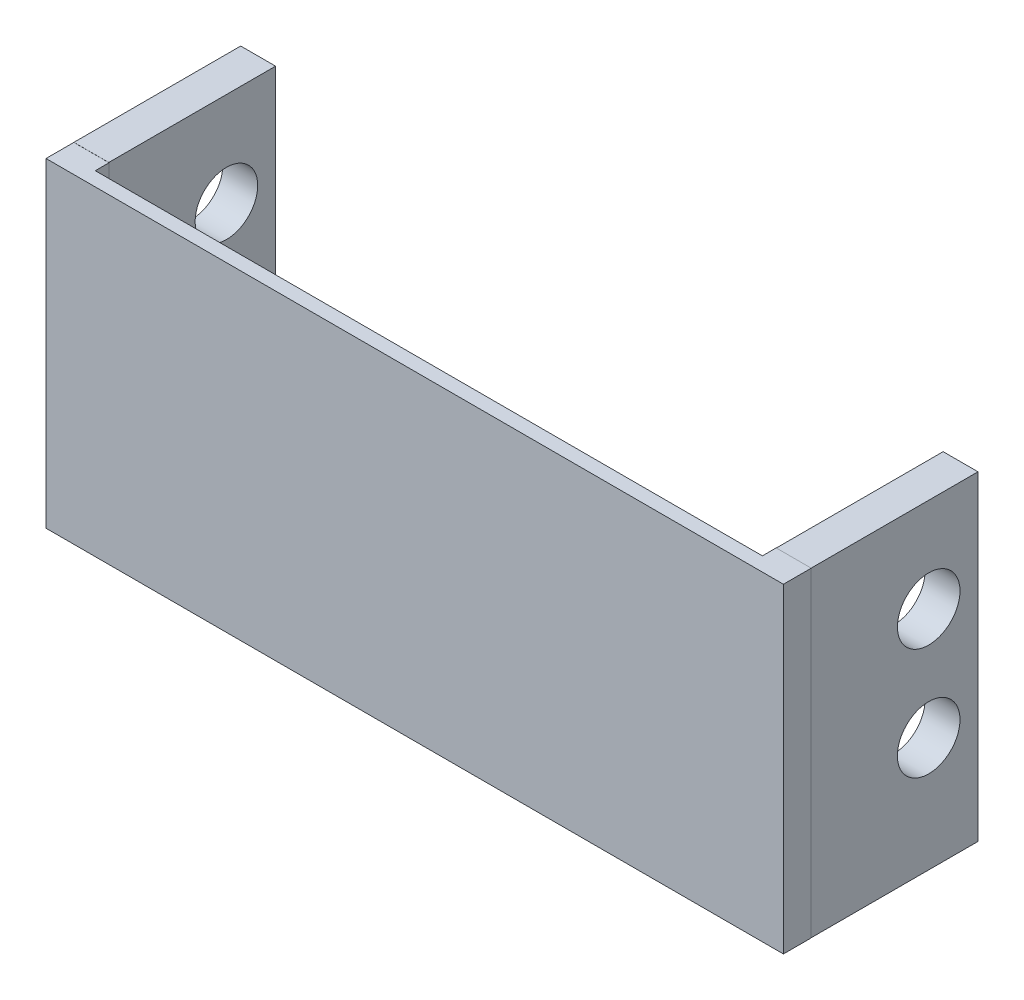
ISO-10303-21;
HEADER;
FILE_DESCRIPTION(('STEP AP214'),'2;1');
FILE_NAME('part.step','',(''),(''),'','','');
FILE_SCHEMA(('AUTOMOTIVE_DESIGN { 1 0 10303 214 1 1 1 1 }'));
ENDSEC;
DATA;
#1=APPLICATION_CONTEXT('core data for automotive mechanical design processes');
#2=APPLICATION_PROTOCOL_DEFINITION('international standard','automotive_design',2000,#1);
#3=PRODUCT_CONTEXT('',#1,'mechanical');
#4=PRODUCT('Part','Part','',(#3));
#5=PRODUCT_RELATED_PRODUCT_CATEGORY('part','',(#4));
#6=PRODUCT_DEFINITION_FORMATION('','',#4);
#7=PRODUCT_DEFINITION_CONTEXT('part definition',#1,'design');
#8=PRODUCT_DEFINITION('design','',#6,#7);
#9=PRODUCT_DEFINITION_SHAPE('','',#8);
#10=(LENGTH_UNIT() NAMED_UNIT(*) SI_UNIT(.MILLI.,.METRE.));
#11=(NAMED_UNIT(*) PLANE_ANGLE_UNIT() SI_UNIT($,.RADIAN.));
#12=(NAMED_UNIT(*) SI_UNIT($,.STERADIAN.) SOLID_ANGLE_UNIT());
#13=UNCERTAINTY_MEASURE_WITH_UNIT(LENGTH_MEASURE(1.E-05),#10,'distance_accuracy_value','');
#14=(GEOMETRIC_REPRESENTATION_CONTEXT(3) GLOBAL_UNCERTAINTY_ASSIGNED_CONTEXT((#13)) GLOBAL_UNIT_ASSIGNED_CONTEXT((#10,
#11,#12)) REPRESENTATION_CONTEXT('',''));
#15=CARTESIAN_POINT('',(0.,0.,0.));
#16=DIRECTION('',(0.,0.,1.));
#17=DIRECTION('',(1.,0.,0.));
#18=AXIS2_PLACEMENT_3D('',#15,#16,#17);
#19=CARTESIAN_POINT('',(2.98586905244974,10.,-3.76990118881425));
#20=DIRECTION('',(0.,0.,1.));
#21=DIRECTION('',(1.,0.,0.));
#22=AXIS2_PLACEMENT_3D('',#19,#20,#21);
#23=PLANE('',#22);
#24=DIRECTION('',(-1.,0.,0.));
#25=VECTOR('',#24,1.);
#26=CARTESIAN_POINT('',(2.98586905244974,10.,-3.76990118881425));
#27=LINE('',#26,#25);
#28=CARTESIAN_POINT('',(-47.4834622699063,10.,-3.76990118881425));
#29=VERTEX_POINT('',#28);
#30=CARTESIAN_POINT('',(-47.504540719018,10.,-3.76990118881425));
#31=VERTEX_POINT('',#30);
#32=EDGE_CURVE('E297',#29,#31,#27,.T.);
#33=ORIENTED_EDGE('',*,*,#32,.F.);
#34=DIRECTION('',(0.,-1.,0.));
#35=VECTOR('',#34,1.);
#36=CARTESIAN_POINT('',(-47.4834622699063,10.,-3.76990118881424));
#37=LINE('',#36,#35);
#38=CARTESIAN_POINT('',(-47.4834622699063,-13.0149445748677,-3.76990118881425));
#39=VERTEX_POINT('',#38);
#40=EDGE_CURVE('E192',#29,#39,#37,.T.);
#41=ORIENTED_EDGE('',*,*,#40,.T.);
#42=DIRECTION('',(-1.,0.,0.));
#43=VECTOR('',#42,1.);
#44=CARTESIAN_POINT('',(2.98586905244974,-13.0149445748677,-3.76990118881425));
#45=LINE('',#44,#43);
#46=CARTESIAN_POINT('',(-50.0141309475503,-13.0149445748677,-3.76990118881424));
#47=VERTEX_POINT('',#46);
#48=EDGE_CURVE('E278',#39,#47,#45,.T.);
#49=ORIENTED_EDGE('',*,*,#48,.T.);
#50=DIRECTION('',(0.,-1.,0.));
#51=VECTOR('',#50,1.);
#52=CARTESIAN_POINT('',(-50.0141309475503,10.,-3.76990118881424));
#53=LINE('',#52,#51);
#54=CARTESIAN_POINT('',(-50.0141309475503,10.,-3.76990118881424));
#55=VERTEX_POINT('',#54);
#56=EDGE_CURVE('E312',#55,#47,#53,.T.);
#57=ORIENTED_EDGE('',*,*,#56,.F.);
#58=CARTESIAN_POINT('',(-50.0110971380678,10.,-3.76990118881424));
#59=VERTEX_POINT('',#58);
#60=EDGE_CURVE('E292',#59,#55,#27,.T.);
#61=ORIENTED_EDGE('',*,*,#60,.F.);
#62=DIRECTION('',(0.,1.,0.));
#63=VECTOR('',#62,1.);
#64=CARTESIAN_POINT('',(-50.0110971380678,10.007083724247,-3.76990118881425));
#65=LINE('',#64,#63);
#66=CARTESIAN_POINT('',(-50.0110971380678,-13.0074239564237,-3.76990118881425));
#67=VERTEX_POINT('',#66);
#68=EDGE_CURVE('E59',#67,#59,#65,.T.);
#69=ORIENTED_EDGE('',*,*,#68,.F.);
#70=DIRECTION('',(-1.,0.,0.));
#71=VECTOR('',#70,1.);
#72=CARTESIAN_POINT('',(-50.0110971380678,-13.0074239564237,-3.76990118881425));
#73=LINE('',#72,#71);
#74=CARTESIAN_POINT('',(-47.504540719018,-13.0074239564237,-3.76990118881425));
#75=VERTEX_POINT('',#74);
#76=EDGE_CURVE('E220',#75,#67,#73,.T.);
#77=ORIENTED_EDGE('',*,*,#76,.F.);
#78=DIRECTION('',(0.,-1.,0.));
#79=VECTOR('',#78,1.);
#80=CARTESIAN_POINT('',(-47.504540719018,10.007083724247,-3.76990118881425));
#81=LINE('',#80,#79);
#82=EDGE_CURVE('E230',#31,#75,#81,.T.);
#83=ORIENTED_EDGE('',*,*,#82,.F.);
#84=EDGE_LOOP('',(#33,#41,#49,#57,#61,#69,#77,#83));
#85=FACE_BOUND('',#84,.T.);
#86=ADVANCED_FACE('F37',(#85),#23,.F.);
#87=CARTESIAN_POINT('',(0.465869112344081,-13.0149445748677,-3.76990118881425));
#88=VERTEX_POINT('',#87);
#89=CARTESIAN_POINT('',(0.463497532440016,-13.0149445748677,-3.76990118881425));
#90=VERTEX_POINT('',#89);
#91=EDGE_CURVE('E382',#88,#90,#45,.T.);
#92=ORIENTED_EDGE('',*,*,#91,.T.);
#93=DIRECTION('',(0.,1.,0.));
#94=VECTOR('',#93,1.);
#95=CARTESIAN_POINT('',(0.463497532440016,10.,-3.76990118881425));
#96=LINE('',#95,#94);
#97=CARTESIAN_POINT('',(0.463497532440016,10.,-3.76990118881425));
#98=VERTEX_POINT('',#97);
#99=EDGE_CURVE('E51',#90,#98,#96,.T.);
#100=ORIENTED_EDGE('',*,*,#99,.T.);
#101=CARTESIAN_POINT('',(2.98586905244974,10.,-3.76990118881425));
#102=VERTEX_POINT('',#101);
#103=EDGE_CURVE('E293',#102,#98,#27,.T.);
#104=ORIENTED_EDGE('',*,*,#103,.F.);
#105=DIRECTION('',(0.,-1.,0.));
#106=VECTOR('',#105,1.);
#107=CARTESIAN_POINT('',(2.98586905244974,10.,-3.76990118881425));
#108=LINE('',#107,#106);
#109=CARTESIAN_POINT('',(2.98586905244974,-13.0149445748677,-3.76990118881425));
#110=VERTEX_POINT('',#109);
#111=EDGE_CURVE('E306',#102,#110,#108,.T.);
#112=ORIENTED_EDGE('',*,*,#111,.T.);
#113=CARTESIAN_POINT('',(2.97084689520682,-13.0149445748677,-3.76990118881425));
#114=VERTEX_POINT('',#113);
#115=EDGE_CURVE('E279',#110,#114,#45,.T.);
#116=ORIENTED_EDGE('',*,*,#115,.T.);
#117=DIRECTION('',(0.,-1.,0.));
#118=VECTOR('',#117,1.);
#119=CARTESIAN_POINT('',(2.97084689520682,9.99224428676371,-3.76990118881425));
#120=LINE('',#119,#118);
#121=CARTESIAN_POINT('',(2.97084689520682,9.99224428676371,-3.76990118881425));
#122=VERTEX_POINT('',#121);
#123=EDGE_CURVE('E257',#122,#114,#120,.T.);
#124=ORIENTED_EDGE('',*,*,#123,.F.);
#125=DIRECTION('',(1.,0.,0.));
#126=VECTOR('',#125,1.);
#127=CARTESIAN_POINT('',(2.97084689520682,9.99224428676371,-3.76990118881425));
#128=LINE('',#127,#126);
#129=CARTESIAN_POINT('',(0.465869112344081,9.99224428676371,-3.76990118881425));
#130=VERTEX_POINT('',#129);
#131=EDGE_CURVE('E250',#130,#122,#128,.T.);
#132=ORIENTED_EDGE('',*,*,#131,.F.);
#133=DIRECTION('',(0.,1.,0.));
#134=VECTOR('',#133,1.);
#135=CARTESIAN_POINT('',(0.465869112344081,9.99224428676371,-3.76990118881425));
#136=LINE('',#135,#134);
#137=EDGE_CURVE('E45',#88,#130,#136,.T.);
#138=ORIENTED_EDGE('',*,*,#137,.F.);
#139=EDGE_LOOP('',(#92,#100,#104,#112,#116,#124,#132,#138));
#140=FACE_BOUND('',#139,.T.);
#141=ADVANCED_FACE('F39',(#140),#23,.F.);
#142=CARTESIAN_POINT('',(-50.0141309475503,10.,-1.76990118881424));
#143=DIRECTION('',(-1.,0.,0.));
#144=DIRECTION('',(0.,0.,1.));
#145=AXIS2_PLACEMENT_3D('',#142,#143,#144);
#146=PLANE('',#145);
#147=ORIENTED_EDGE('',*,*,#56,.T.);
#148=DIRECTION('',(0.,0.,-1.));
#149=VECTOR('',#148,1.);
#150=CARTESIAN_POINT('',(-50.0141309475503,-13.0149445748677,-1.76990118881424));
#151=LINE('',#150,#149);
#152=CARTESIAN_POINT('',(-50.0141309475503,-13.0149445748677,-1.76990118881424));
#153=VERTEX_POINT('',#152);
#154=EDGE_CURVE('E282',#153,#47,#151,.T.);
#155=ORIENTED_EDGE('',*,*,#154,.F.);
#156=DIRECTION('',(0.,-1.,0.));
#157=VECTOR('',#156,1.);
#158=CARTESIAN_POINT('',(-50.0141309475503,10.,-1.76990118881424));
#159=LINE('',#158,#157);
#160=CARTESIAN_POINT('',(-50.0141309475503,10.,-1.76990118881424));
#161=VERTEX_POINT('',#160);
#162=EDGE_CURVE('E310',#161,#153,#159,.T.);
#163=ORIENTED_EDGE('',*,*,#162,.F.);
#164=DIRECTION('',(0.,0.,-1.));
#165=VECTOR('',#164,1.);
#166=CARTESIAN_POINT('',(-50.0141309475503,10.,-1.76990118881424));
#167=LINE('',#166,#165);
#168=EDGE_CURVE('E296',#161,#55,#167,.T.);
#169=ORIENTED_EDGE('',*,*,#168,.T.);
#170=EDGE_LOOP('',(#147,#155,#163,#169));
#171=FACE_BOUND('',#170,.T.);
#172=ADVANCED_FACE('F357',(#171),#146,.T.);
#173=CARTESIAN_POINT('',(2.98586905244974,10.,-1.76990118881425));
#174=DIRECTION('',(0.,0.,1.));
#175=DIRECTION('',(1.,0.,0.));
#176=AXIS2_PLACEMENT_3D('',#173,#174,#175);
#177=PLANE('',#176);
#178=ORIENTED_EDGE('',*,*,#162,.T.);
#179=DIRECTION('',(-1.,0.,0.));
#180=VECTOR('',#179,1.);
#181=CARTESIAN_POINT('',(2.98586905244974,-13.0149445748677,-1.76990118881425));
#182=LINE('',#181,#180);
#183=CARTESIAN_POINT('',(2.98586905244974,-13.0149445748677,-1.76990118881425));
#184=VERTEX_POINT('',#183);
#185=EDGE_CURVE('E286',#184,#153,#182,.T.);
#186=ORIENTED_EDGE('',*,*,#185,.F.);
#187=DIRECTION('',(0.,-1.,0.));
#188=VECTOR('',#187,1.);
#189=CARTESIAN_POINT('',(2.98586905244974,10.,-1.76990118881425));
#190=LINE('',#189,#188);
#191=CARTESIAN_POINT('',(2.98586905244974,10.,-1.76990118881425));
#192=VERTEX_POINT('',#191);
#193=EDGE_CURVE('E308',#192,#184,#190,.T.);
#194=ORIENTED_EDGE('',*,*,#193,.F.);
#195=DIRECTION('',(-1.,0.,0.));
#196=VECTOR('',#195,1.);
#197=CARTESIAN_POINT('',(2.98586905244974,10.,-1.76990118881425));
#198=LINE('',#197,#196);
#199=EDGE_CURVE('E301',#192,#161,#198,.T.);
#200=ORIENTED_EDGE('',*,*,#199,.T.);
#201=EDGE_LOOP('',(#178,#186,#194,#200));
#202=FACE_BOUND('',#201,.T.);
#203=ADVANCED_FACE('F374',(#202),#177,.T.);
#204=CARTESIAN_POINT('',(2.98586905244974,10.,-1.76990118881425));
#205=DIRECTION('',(-1.,0.,0.));
#206=DIRECTION('',(0.,0.,1.));
#207=AXIS2_PLACEMENT_3D('',#204,#205,#206);
#208=PLANE('',#207);
#209=ORIENTED_EDGE('',*,*,#193,.T.);
#210=DIRECTION('',(0.,0.,-1.));
#211=VECTOR('',#210,1.);
#212=CARTESIAN_POINT('',(2.98586905244974,-13.0149445748677,-1.76990118881425));
#213=LINE('',#212,#211);
#214=EDGE_CURVE('E289',#184,#110,#213,.T.);
#215=ORIENTED_EDGE('',*,*,#214,.T.);
#216=ORIENTED_EDGE('',*,*,#111,.F.);
#217=DIRECTION('',(0.,0.,-1.));
#218=VECTOR('',#217,1.);
#219=CARTESIAN_POINT('',(2.98586905244974,10.,-1.76990118881425));
#220=LINE('',#219,#218);
#221=EDGE_CURVE('E304',#192,#102,#220,.T.);
#222=ORIENTED_EDGE('',*,*,#221,.F.);
#223=EDGE_LOOP('',(#209,#215,#216,#222));
#224=FACE_BOUND('',#223,.T.);
#225=ADVANCED_FACE('F379',(#224),#208,.F.);
#226=CARTESIAN_POINT('',(0.,10.,0.));
#227=DIRECTION('',(0.,-1.,0.));
#228=DIRECTION('',(0.,0.,-1.));
#229=AXIS2_PLACEMENT_3D('',#226,#227,#228);
#230=PLANE('',#229);
#231=DIRECTION('',(-1.,0.,0.));
#232=VECTOR('',#231,1.);
#233=CARTESIAN_POINT('',(0.,10.,-2.78066110035931));
#234=LINE('',#233,#232);
#235=CARTESIAN_POINT('',(0.463497532440016,10.,-2.78066110035931));
#236=VERTEX_POINT('',#235);
#237=CARTESIAN_POINT('',(-47.4834622699063,10.,-2.78066110035931));
#238=VERTEX_POINT('',#237);
#239=EDGE_CURVE('E170',#236,#238,#234,.T.);
#240=ORIENTED_EDGE('',*,*,#239,.T.);
#241=DIRECTION('',(0.,0.,-1.));
#242=VECTOR('',#241,1.);
#243=CARTESIAN_POINT('',(-47.4834622699063,10.,0.));
#244=LINE('',#243,#242);
#245=EDGE_CURVE('E189',#238,#29,#244,.T.);
#246=ORIENTED_EDGE('',*,*,#245,.T.);
#247=ORIENTED_EDGE('',*,*,#32,.T.);
#248=EDGE_CURVE('E298',#31,#59,#27,.T.);
#249=ORIENTED_EDGE('',*,*,#248,.T.);
#250=ORIENTED_EDGE('',*,*,#60,.T.);
#251=ORIENTED_EDGE('',*,*,#168,.F.);
#252=ORIENTED_EDGE('',*,*,#199,.F.);
#253=ORIENTED_EDGE('',*,*,#221,.T.);
#254=ORIENTED_EDGE('',*,*,#103,.T.);
#255=DIRECTION('',(0.,0.,1.));
#256=VECTOR('',#255,1.);
#257=CARTESIAN_POINT('',(0.463497532440016,10.,0.));
#258=LINE('',#257,#256);
#259=EDGE_CURVE('E184',#98,#236,#258,.T.);
#260=ORIENTED_EDGE('',*,*,#259,.T.);
#261=EDGE_LOOP('',(#240,#246,#247,#249,#250,#251,#252,#253,#254,#260));
#262=FACE_BOUND('',#261,.T.);
#263=ADVANCED_FACE('F368',(#262),#230,.F.);
#264=CARTESIAN_POINT('',(0.,-13.0149445748677,0.));
#265=DIRECTION('',(0.,-1.,0.));
#266=DIRECTION('',(0.,0.,-1.));
#267=AXIS2_PLACEMENT_3D('',#264,#265,#266);
#268=PLANE('',#267);
#269=DIRECTION('',(0.,0.,-1.));
#270=VECTOR('',#269,1.);
#271=CARTESIAN_POINT('',(-47.4834622699063,-13.0149445748677,-3.77763659052426));
#272=LINE('',#271,#270);
#273=CARTESIAN_POINT('',(-47.4834622699063,-13.0149445748677,-2.78066110035931));
#274=VERTEX_POINT('',#273);
#275=EDGE_CURVE('E180',#274,#39,#272,.T.);
#276=ORIENTED_EDGE('',*,*,#275,.F.);
#277=DIRECTION('',(-1.,0.,0.));
#278=VECTOR('',#277,1.);
#279=CARTESIAN_POINT('',(-47.4834622699063,-13.0149445748677,-2.78066110035931));
#280=LINE('',#279,#278);
#281=CARTESIAN_POINT('',(0.463497532440016,-13.0149445748677,-2.78066110035931));
#282=VERTEX_POINT('',#281);
#283=EDGE_CURVE('E167',#282,#274,#280,.T.);
#284=ORIENTED_EDGE('',*,*,#283,.F.);
#285=DIRECTION('',(0.,0.,1.));
#286=VECTOR('',#285,1.);
#287=CARTESIAN_POINT('',(0.463497532440016,-13.0149445748677,0.));
#288=LINE('',#287,#286);
#289=EDGE_CURVE('E11',#90,#282,#288,.T.);
#290=ORIENTED_EDGE('',*,*,#289,.F.);
#291=ORIENTED_EDGE('',*,*,#91,.F.);
#292=EDGE_CURVE('E283',#114,#88,#45,.T.);
#293=ORIENTED_EDGE('',*,*,#292,.F.);
#294=ORIENTED_EDGE('',*,*,#115,.F.);
#295=ORIENTED_EDGE('',*,*,#214,.F.);
#296=ORIENTED_EDGE('',*,*,#185,.T.);
#297=ORIENTED_EDGE('',*,*,#154,.T.);
#298=ORIENTED_EDGE('',*,*,#48,.F.);
#299=EDGE_LOOP('',(#276,#284,#290,#291,#293,#294,#295,#296,#297,#298));
#300=FACE_BOUND('',#299,.T.);
#301=ADVANCED_FACE('F178',(#300),#268,.T.);
#302=CARTESIAN_POINT('',(0.,0.,-3.76990118881425));
#303=DIRECTION('',(0.,0.,-1.));
#304=DIRECTION('',(-1.,0.,0.));
#305=AXIS2_PLACEMENT_3D('',#302,#303,#304);
#306=PLANE('',#305);
#307=CARTESIAN_POINT('',(2.97084689520682,-13.0179644992836,-3.76990118881425));
#308=VERTEX_POINT('',#307);
#309=EDGE_CURVE('E245',#114,#308,#120,.T.);
#310=ORIENTED_EDGE('',*,*,#309,.F.);
#311=ORIENTED_EDGE('',*,*,#292,.T.);
#312=CARTESIAN_POINT('',(0.465869112344081,-13.0179644992836,-3.76990118881425));
#313=VERTEX_POINT('',#312);
#314=EDGE_CURVE('E262',#313,#88,#136,.T.);
#315=ORIENTED_EDGE('',*,*,#314,.F.);
#316=DIRECTION('',(-1.,0.,0.));
#317=VECTOR('',#316,1.);
#318=CARTESIAN_POINT('',(2.97084689520682,-13.0179644992836,-3.76990118881425));
#319=LINE('',#318,#317);
#320=EDGE_CURVE('E260',#308,#313,#319,.T.);
#321=ORIENTED_EDGE('',*,*,#320,.F.);
#322=EDGE_LOOP('',(#310,#311,#315,#321));
#323=FACE_BOUND('',#322,.T.);
#324=ADVANCED_FACE('F388',(#323),#306,.F.);
#325=CARTESIAN_POINT('',(2.97084689520682,9.99224428676371,-15.7699011888142));
#326=DIRECTION('',(-1.,0.,0.));
#327=DIRECTION('',(0.,0.,1.));
#328=AXIS2_PLACEMENT_3D('',#325,#326,#327);
#329=PLANE('',#328);
#330=CARTESIAN_POINT('',(2.97084689520682,-4.78842033576043,-12.2242831944801));
#331=DIRECTION('',(1.,0.,0.));
#332=DIRECTION('',(0.,0.,-1.));
#333=AXIS2_PLACEMENT_3D('',#330,#331,#332);
#334=CIRCLE('',#333,2.25);
#335=CARTESIAN_POINT('',(2.97084689520682,-4.78842033576043,-14.4742831944801));
#336=VERTEX_POINT('',#335);
#337=EDGE_CURVE('E196',#336,#336,#334,.T.);
#338=ORIENTED_EDGE('',*,*,#337,.F.);
#339=EDGE_LOOP('',(#338));
#340=FACE_BOUND('',#339,.T.);
#341=CARTESIAN_POINT('',(2.97084689520682,3.22624370875779,-12.226476122601));
#342=DIRECTION('',(1.,0.,0.));
#343=DIRECTION('',(0.,0.,-1.));
#344=AXIS2_PLACEMENT_3D('',#341,#342,#343);
#345=CIRCLE('',#344,2.24877425502807);
#346=CARTESIAN_POINT('',(2.97084689520682,3.22624370875779,-14.475250377629));
#347=VERTEX_POINT('',#346);
#348=EDGE_CURVE('E195',#347,#347,#345,.T.);
#349=ORIENTED_EDGE('',*,*,#348,.F.);
#350=EDGE_LOOP('',(#349));
#351=FACE_BOUND('',#350,.T.);
#352=ORIENTED_EDGE('',*,*,#123,.T.);
#353=ORIENTED_EDGE('',*,*,#309,.T.);
#354=DIRECTION('',(0.,0.,1.));
#355=VECTOR('',#354,1.);
#356=CARTESIAN_POINT('',(2.97084689520682,-13.0179644992836,-15.7699011888142));
#357=LINE('',#356,#355);
#358=CARTESIAN_POINT('',(2.97084689520682,-13.0179644992836,-15.7699011888142));
#359=VERTEX_POINT('',#358);
#360=EDGE_CURVE('E275',#359,#308,#357,.T.);
#361=ORIENTED_EDGE('',*,*,#360,.F.);
#362=DIRECTION('',(0.,-1.,0.));
#363=VECTOR('',#362,1.);
#364=CARTESIAN_POINT('',(2.97084689520682,9.99224428676371,-15.7699011888142));
#365=LINE('',#364,#363);
#366=CARTESIAN_POINT('',(2.97084689520682,9.99224428676371,-15.7699011888142));
#367=VERTEX_POINT('',#366);
#368=EDGE_CURVE('E246',#367,#359,#365,.T.);
#369=ORIENTED_EDGE('',*,*,#368,.F.);
#370=DIRECTION('',(0.,0.,1.));
#371=VECTOR('',#370,1.);
#372=CARTESIAN_POINT('',(2.97084689520682,9.99224428676371,-15.7699011888142));
#373=LINE('',#372,#371);
#374=EDGE_CURVE('E256',#367,#122,#373,.T.);
#375=ORIENTED_EDGE('',*,*,#374,.T.);
#376=EDGE_LOOP('',(#352,#353,#361,#369,#375));
#377=FACE_BOUND('',#376,.T.);
#378=ADVANCED_FACE('F400',(#340,#351,#377),#329,.F.);
#379=CARTESIAN_POINT('',(2.97084689520682,-13.0179644992836,-15.7699011888142));
#380=DIRECTION('',(0.,1.,0.));
#381=DIRECTION('',(0.,0.,1.));
#382=AXIS2_PLACEMENT_3D('',#379,#380,#381);
#383=PLANE('',#382);
#384=ORIENTED_EDGE('',*,*,#320,.T.);
#385=DIRECTION('',(0.,0.,1.));
#386=VECTOR('',#385,1.);
#387=CARTESIAN_POINT('',(0.465869112344081,-13.0179644992836,-15.7699011888142));
#388=LINE('',#387,#386);
#389=CARTESIAN_POINT('',(0.465869112344081,-13.0179644992836,-15.7699011888142));
#390=VERTEX_POINT('',#389);
#391=EDGE_CURVE('E272',#390,#313,#388,.T.);
#392=ORIENTED_EDGE('',*,*,#391,.F.);
#393=DIRECTION('',(-1.,0.,0.));
#394=VECTOR('',#393,1.);
#395=CARTESIAN_POINT('',(2.97084689520682,-13.0179644992836,-15.7699011888142));
#396=LINE('',#395,#394);
#397=EDGE_CURVE('E249',#359,#390,#396,.T.);
#398=ORIENTED_EDGE('',*,*,#397,.F.);
#399=ORIENTED_EDGE('',*,*,#360,.T.);
#400=EDGE_LOOP('',(#384,#392,#398,#399));
#401=FACE_BOUND('',#400,.T.);
#402=ADVANCED_FACE('F396',(#401),#383,.F.);
#403=CARTESIAN_POINT('',(0.465869112344081,9.99224428676371,-15.7699011888142));
#404=DIRECTION('',(1.,0.,0.));
#405=DIRECTION('',(0.,0.,-1.));
#406=AXIS2_PLACEMENT_3D('',#403,#404,#405);
#407=PLANE('',#406);
#408=CARTESIAN_POINT('',(0.465869112344086,-4.78842033576043,-12.2242831944801));
#409=DIRECTION('',(1.,0.,0.));
#410=DIRECTION('',(0.,0.,-1.));
#411=AXIS2_PLACEMENT_3D('',#408,#409,#410);
#412=CIRCLE('',#411,2.25);
#413=CARTESIAN_POINT('',(0.465869112344086,-4.78842033576043,-14.4742831944801));
#414=VERTEX_POINT('',#413);
#415=EDGE_CURVE('E212',#414,#414,#412,.T.);
#416=ORIENTED_EDGE('',*,*,#415,.T.);
#417=EDGE_LOOP('',(#416));
#418=FACE_BOUND('',#417,.T.);
#419=CARTESIAN_POINT('',(0.465869112344086,3.22624370875779,-12.226476122601));
#420=DIRECTION('',(1.,0.,0.));
#421=DIRECTION('',(0.,0.,-1.));
#422=AXIS2_PLACEMENT_3D('',#419,#420,#421);
#423=CIRCLE('',#422,2.24877425502807);
#424=CARTESIAN_POINT('',(0.465869112344086,3.22624370875779,-14.475250377629));
#425=VERTEX_POINT('',#424);
#426=EDGE_CURVE('E205',#425,#425,#423,.T.);
#427=ORIENTED_EDGE('',*,*,#426,.T.);
#428=EDGE_LOOP('',(#427));
#429=FACE_BOUND('',#428,.T.);
#430=ORIENTED_EDGE('',*,*,#314,.T.);
#431=ORIENTED_EDGE('',*,*,#137,.T.);
#432=DIRECTION('',(0.,0.,1.));
#433=VECTOR('',#432,1.);
#434=CARTESIAN_POINT('',(0.465869112344081,9.99224428676371,-15.7699011888142));
#435=LINE('',#434,#433);
#436=CARTESIAN_POINT('',(0.465869112344081,9.99224428676371,-15.7699011888142));
#437=VERTEX_POINT('',#436);
#438=EDGE_CURVE('E269',#437,#130,#435,.T.);
#439=ORIENTED_EDGE('',*,*,#438,.F.);
#440=DIRECTION('',(0.,1.,0.));
#441=VECTOR('',#440,1.);
#442=CARTESIAN_POINT('',(0.465869112344081,9.99224428676371,-15.7699011888142));
#443=LINE('',#442,#441);
#444=EDGE_CURVE('E252',#390,#437,#443,.T.);
#445=ORIENTED_EDGE('',*,*,#444,.F.);
#446=ORIENTED_EDGE('',*,*,#391,.T.);
#447=EDGE_LOOP('',(#430,#431,#439,#445,#446));
#448=FACE_BOUND('',#447,.T.);
#449=ADVANCED_FACE('F391',(#418,#429,#448),#407,.F.);
#450=CARTESIAN_POINT('',(2.97084689520682,9.99224428676371,-15.7699011888142));
#451=DIRECTION('',(0.,-1.,0.));
#452=DIRECTION('',(0.,0.,-1.));
#453=AXIS2_PLACEMENT_3D('',#450,#451,#452);
#454=PLANE('',#453);
#455=ORIENTED_EDGE('',*,*,#131,.T.);
#456=ORIENTED_EDGE('',*,*,#374,.F.);
#457=DIRECTION('',(1.,0.,0.));
#458=VECTOR('',#457,1.);
#459=CARTESIAN_POINT('',(2.97084689520682,9.99224428676371,-15.7699011888142));
#460=LINE('',#459,#458);
#461=EDGE_CURVE('E254',#437,#367,#460,.T.);
#462=ORIENTED_EDGE('',*,*,#461,.F.);
#463=ORIENTED_EDGE('',*,*,#438,.T.);
#464=EDGE_LOOP('',(#455,#456,#462,#463));
#465=FACE_BOUND('',#464,.T.);
#466=ADVANCED_FACE('F403',(#465),#454,.F.);
#467=CARTESIAN_POINT('',(0.,0.,-15.7699011888142));
#468=DIRECTION('',(0.,0.,-1.));
#469=DIRECTION('',(-1.,0.,0.));
#470=AXIS2_PLACEMENT_3D('',#467,#468,#469);
#471=PLANE('',#470);
#472=ORIENTED_EDGE('',*,*,#368,.T.);
#473=ORIENTED_EDGE('',*,*,#397,.T.);
#474=ORIENTED_EDGE('',*,*,#444,.T.);
#475=ORIENTED_EDGE('',*,*,#461,.T.);
#476=EDGE_LOOP('',(#472,#473,#474,#475));
#477=FACE_BOUND('',#476,.T.);
#478=ADVANCED_FACE('F406',(#477),#471,.T.);
#479=CARTESIAN_POINT('',(0.,0.,-3.76990118881425));
#480=DIRECTION('',(0.,0.,1.));
#481=DIRECTION('',(1.,0.,0.));
#482=AXIS2_PLACEMENT_3D('',#479,#480,#481);
#483=PLANE('',#482);
#484=ORIENTED_EDGE('',*,*,#248,.F.);
#485=CARTESIAN_POINT('',(-47.504540719018,10.007083724247,-3.76990118881425));
#486=VERTEX_POINT('',#485);
#487=EDGE_CURVE('E231',#486,#31,#81,.T.);
#488=ORIENTED_EDGE('',*,*,#487,.F.);
#489=DIRECTION('',(1.,0.,0.));
#490=VECTOR('',#489,1.);
#491=CARTESIAN_POINT('',(-50.0110971380678,10.007083724247,-3.76990118881425));
#492=LINE('',#491,#490);
#493=CARTESIAN_POINT('',(-50.0110971380678,10.007083724247,-3.76990118881425));
#494=VERTEX_POINT('',#493);
#495=EDGE_CURVE('E228',#494,#486,#492,.T.);
#496=ORIENTED_EDGE('',*,*,#495,.F.);
#497=EDGE_CURVE('E215',#59,#494,#65,.T.);
#498=ORIENTED_EDGE('',*,*,#497,.F.);
#499=EDGE_LOOP('',(#484,#488,#496,#498));
#500=FACE_BOUND('',#499,.T.);
#501=ADVANCED_FACE('F335',(#500),#483,.T.);
#502=CARTESIAN_POINT('',(-50.0110971380678,10.007083724247,-15.7599082716708));
#503=DIRECTION('',(1.,0.,0.));
#504=DIRECTION('',(0.,0.,-1.));
#505=AXIS2_PLACEMENT_3D('',#502,#503,#504);
#506=PLANE('',#505);
#507=CARTESIAN_POINT('',(-50.0110971380678,-4.78842033576043,-12.2242831944801));
#508=DIRECTION('',(1.,0.,0.));
#509=DIRECTION('',(0.,0.,-1.));
#510=AXIS2_PLACEMENT_3D('',#507,#508,#509);
#511=CIRCLE('',#510,2.25);
#512=CARTESIAN_POINT('',(-50.0110971380678,-4.78842033576043,-14.4742831944801));
#513=VERTEX_POINT('',#512);
#514=EDGE_CURVE('E209',#513,#513,#511,.T.);
#515=ORIENTED_EDGE('',*,*,#514,.T.);
#516=EDGE_LOOP('',(#515));
#517=FACE_BOUND('',#516,.T.);
#518=CARTESIAN_POINT('',(-50.0110971380678,3.22624370875779,-12.226476122601));
#519=DIRECTION('',(1.,0.,0.));
#520=DIRECTION('',(0.,0.,-1.));
#521=AXIS2_PLACEMENT_3D('',#518,#519,#520);
#522=CIRCLE('',#521,2.24877425502807);
#523=CARTESIAN_POINT('',(-50.0110971380678,3.22624370875779,-14.475250377629));
#524=VERTEX_POINT('',#523);
#525=EDGE_CURVE('E202',#524,#524,#522,.T.);
#526=ORIENTED_EDGE('',*,*,#525,.T.);
#527=EDGE_LOOP('',(#526));
#528=FACE_BOUND('',#527,.T.);
#529=ORIENTED_EDGE('',*,*,#68,.T.);
#530=ORIENTED_EDGE('',*,*,#497,.T.);
#531=DIRECTION('',(0.,0.,1.));
#532=VECTOR('',#531,1.);
#533=CARTESIAN_POINT('',(-50.0110971380678,10.007083724247,-15.7599082716708));
#534=LINE('',#533,#532);
#535=CARTESIAN_POINT('',(-50.0110971380678,10.007083724247,-15.7599082716708));
#536=VERTEX_POINT('',#535);
#537=EDGE_CURVE('E242',#536,#494,#534,.T.);
#538=ORIENTED_EDGE('',*,*,#537,.F.);
#539=DIRECTION('',(0.,1.,0.));
#540=VECTOR('',#539,1.);
#541=CARTESIAN_POINT('',(-50.0110971380678,10.007083724247,-15.7599082716708));
#542=LINE('',#541,#540);
#543=CARTESIAN_POINT('',(-50.0110971380678,-13.0074239564237,-15.7599082716708));
#544=VERTEX_POINT('',#543);
#545=EDGE_CURVE('E216',#544,#536,#542,.T.);
#546=ORIENTED_EDGE('',*,*,#545,.F.);
#547=DIRECTION('',(0.,0.,1.));
#548=VECTOR('',#547,1.);
#549=CARTESIAN_POINT('',(-50.0110971380678,-13.0074239564237,-15.7599082716708));
#550=LINE('',#549,#548);
#551=EDGE_CURVE('E226',#544,#67,#550,.T.);
#552=ORIENTED_EDGE('',*,*,#551,.T.);
#553=EDGE_LOOP('',(#529,#530,#538,#546,#552));
#554=FACE_BOUND('',#553,.T.);
#555=ADVANCED_FACE('F331',(#517,#528,#554),#506,.F.);
#556=CARTESIAN_POINT('',(-50.0110971380678,10.007083724247,-15.7599082716708));
#557=DIRECTION('',(0.,-1.,0.));
#558=DIRECTION('',(0.,0.,-1.));
#559=AXIS2_PLACEMENT_3D('',#556,#557,#558);
#560=PLANE('',#559);
#561=ORIENTED_EDGE('',*,*,#495,.T.);
#562=DIRECTION('',(0.,0.,1.));
#563=VECTOR('',#562,1.);
#564=CARTESIAN_POINT('',(-47.504540719018,10.007083724247,-15.7599082716708));
#565=LINE('',#564,#563);
#566=CARTESIAN_POINT('',(-47.504540719018,10.007083724247,-15.7599082716708));
#567=VERTEX_POINT('',#566);
#568=EDGE_CURVE('E239',#567,#486,#565,.T.);
#569=ORIENTED_EDGE('',*,*,#568,.F.);
#570=DIRECTION('',(1.,0.,0.));
#571=VECTOR('',#570,1.);
#572=CARTESIAN_POINT('',(-50.0110971380678,10.007083724247,-15.7599082716708));
#573=LINE('',#572,#571);
#574=EDGE_CURVE('E219',#536,#567,#573,.T.);
#575=ORIENTED_EDGE('',*,*,#574,.F.);
#576=ORIENTED_EDGE('',*,*,#537,.T.);
#577=EDGE_LOOP('',(#561,#569,#575,#576));
#578=FACE_BOUND('',#577,.T.);
#579=ADVANCED_FACE('F334',(#578),#560,.F.);
#580=CARTESIAN_POINT('',(-47.504540719018,10.007083724247,-15.7599082716708));
#581=DIRECTION('',(-1.,0.,0.));
#582=DIRECTION('',(0.,0.,1.));
#583=AXIS2_PLACEMENT_3D('',#580,#581,#582);
#584=PLANE('',#583);
#585=CARTESIAN_POINT('',(-47.504540719018,-4.78842033576043,-12.2242831944801));
#586=DIRECTION('',(-1.,0.,0.));
#587=DIRECTION('',(0.,0.,1.));
#588=AXIS2_PLACEMENT_3D('',#585,#586,#587);
#589=CIRCLE('',#588,2.25);
#590=CARTESIAN_POINT('',(-47.504540719018,-4.78842033576043,-9.9742831944801));
#591=VERTEX_POINT('',#590);
#592=EDGE_CURVE('E208',#591,#591,#589,.T.);
#593=ORIENTED_EDGE('',*,*,#592,.T.);
#594=EDGE_LOOP('',(#593));
#595=FACE_BOUND('',#594,.T.);
#596=CARTESIAN_POINT('',(-47.504540719018,3.22624370875779,-12.226476122601));
#597=DIRECTION('',(-1.,0.,0.));
#598=DIRECTION('',(0.,0.,1.));
#599=AXIS2_PLACEMENT_3D('',#596,#597,#598);
#600=CIRCLE('',#599,2.24877425502807);
#601=CARTESIAN_POINT('',(-47.504540719018,3.22624370875779,-9.9777018675729));
#602=VERTEX_POINT('',#601);
#603=EDGE_CURVE('E199',#602,#602,#600,.T.);
#604=ORIENTED_EDGE('',*,*,#603,.T.);
#605=EDGE_LOOP('',(#604));
#606=FACE_BOUND('',#605,.T.);
#607=ORIENTED_EDGE('',*,*,#487,.T.);
#608=ORIENTED_EDGE('',*,*,#82,.T.);
#609=DIRECTION('',(0.,0.,1.));
#610=VECTOR('',#609,1.);
#611=CARTESIAN_POINT('',(-47.504540719018,-13.0074239564237,-15.7599082716708));
#612=LINE('',#611,#610);
#613=CARTESIAN_POINT('',(-47.504540719018,-13.0074239564237,-15.7599082716708));
#614=VERTEX_POINT('',#613);
#615=EDGE_CURVE('E236',#614,#75,#612,.T.);
#616=ORIENTED_EDGE('',*,*,#615,.F.);
#617=DIRECTION('',(0.,-1.,0.));
#618=VECTOR('',#617,1.);
#619=CARTESIAN_POINT('',(-47.504540719018,10.007083724247,-15.7599082716708));
#620=LINE('',#619,#618);
#621=EDGE_CURVE('E222',#567,#614,#620,.T.);
#622=ORIENTED_EDGE('',*,*,#621,.F.);
#623=ORIENTED_EDGE('',*,*,#568,.T.);
#624=EDGE_LOOP('',(#607,#608,#616,#622,#623));
#625=FACE_BOUND('',#624,.T.);
#626=ADVANCED_FACE('F319',(#595,#606,#625),#584,.F.);
#627=CARTESIAN_POINT('',(-50.0110971380678,-13.0074239564237,-15.7599082716708));
#628=DIRECTION('',(0.,1.,0.));
#629=DIRECTION('',(0.,0.,1.));
#630=AXIS2_PLACEMENT_3D('',#627,#628,#629);
#631=PLANE('',#630);
#632=ORIENTED_EDGE('',*,*,#76,.T.);
#633=ORIENTED_EDGE('',*,*,#551,.F.);
#634=DIRECTION('',(-1.,0.,0.));
#635=VECTOR('',#634,1.);
#636=CARTESIAN_POINT('',(-50.0110971380678,-13.0074239564237,-15.7599082716708));
#637=LINE('',#636,#635);
#638=EDGE_CURVE('E224',#614,#544,#637,.T.);
#639=ORIENTED_EDGE('',*,*,#638,.F.);
#640=ORIENTED_EDGE('',*,*,#615,.T.);
#641=EDGE_LOOP('',(#632,#633,#639,#640));
#642=FACE_BOUND('',#641,.T.);
#643=ADVANCED_FACE('F346',(#642),#631,.F.);
#644=CARTESIAN_POINT('',(0.,0.,-15.7599082716708));
#645=DIRECTION('',(0.,0.,1.));
#646=DIRECTION('',(1.,0.,0.));
#647=AXIS2_PLACEMENT_3D('',#644,#645,#646);
#648=PLANE('',#647);
#649=ORIENTED_EDGE('',*,*,#545,.T.);
#650=ORIENTED_EDGE('',*,*,#574,.T.);
#651=ORIENTED_EDGE('',*,*,#621,.T.);
#652=ORIENTED_EDGE('',*,*,#638,.T.);
#653=EDGE_LOOP('',(#649,#650,#651,#652));
#654=FACE_BOUND('',#653,.T.);
#655=ADVANCED_FACE('F340',(#654),#648,.F.);
#656=CARTESIAN_POINT('',(-68.1983280333827,3.22624370875779,-12.226476122601));
#657=DIRECTION('',(1.,0.,0.));
#658=DIRECTION('',(0.,0.,-1.));
#659=AXIS2_PLACEMENT_3D('',#656,#657,#658);
#660=CYLINDRICAL_SURFACE('',#659,2.24877425502807);
#661=ORIENTED_EDGE('',*,*,#603,.F.);
#662=EDGE_LOOP('',(#661));
#663=FACE_BOUND('',#662,.T.);
#664=ORIENTED_EDGE('',*,*,#525,.F.);
#665=EDGE_LOOP('',(#664));
#666=FACE_BOUND('',#665,.T.);
#667=ADVANCED_FACE('F326',(#663,#666),#660,.F.);
#668=CARTESIAN_POINT('',(-68.1983280333827,-4.78842033576043,-12.2242831944801));
#669=DIRECTION('',(1.,0.,0.));
#670=DIRECTION('',(0.,0.,-1.));
#671=AXIS2_PLACEMENT_3D('',#668,#669,#670);
#672=CYLINDRICAL_SURFACE('',#671,2.25);
#673=ORIENTED_EDGE('',*,*,#592,.F.);
#674=EDGE_LOOP('',(#673));
#675=FACE_BOUND('',#674,.T.);
#676=ORIENTED_EDGE('',*,*,#514,.F.);
#677=EDGE_LOOP('',(#676));
#678=FACE_BOUND('',#677,.T.);
#679=ADVANCED_FACE('F322',(#675,#678),#672,.F.);
#680=ORIENTED_EDGE('',*,*,#348,.T.);
#681=EDGE_LOOP('',(#680));
#682=FACE_BOUND('',#681,.T.);
#683=ORIENTED_EDGE('',*,*,#426,.F.);
#684=EDGE_LOOP('',(#683));
#685=FACE_BOUND('',#684,.T.);
#686=ADVANCED_FACE('F325',(#682,#685),#660,.F.);
#687=ORIENTED_EDGE('',*,*,#337,.T.);
#688=EDGE_LOOP('',(#687));
#689=FACE_BOUND('',#688,.T.);
#690=ORIENTED_EDGE('',*,*,#415,.F.);
#691=EDGE_LOOP('',(#690));
#692=FACE_BOUND('',#691,.T.);
#693=ADVANCED_FACE('F328',(#689,#692),#672,.F.);
#694=CARTESIAN_POINT('',(-47.4834622699063,15.9850554251323,-3.77763659052426));
#695=DIRECTION('',(-1.,0.,0.));
#696=DIRECTION('',(0.,0.,1.));
#697=AXIS2_PLACEMENT_3D('',#694,#695,#696);
#698=PLANE('',#697);
#699=ORIENTED_EDGE('',*,*,#245,.F.);
#700=DIRECTION('',(0.,-1.,0.));
#701=VECTOR('',#700,1.);
#702=CARTESIAN_POINT('',(-47.4834622699063,15.9850554251323,-2.78066110035931));
#703=LINE('',#702,#701);
#704=EDGE_CURVE('E172',#238,#274,#703,.T.);
#705=ORIENTED_EDGE('',*,*,#704,.T.);
#706=ORIENTED_EDGE('',*,*,#275,.T.);
#707=ORIENTED_EDGE('',*,*,#40,.F.);
#708=EDGE_LOOP('',(#699,#705,#706,#707));
#709=FACE_BOUND('',#708,.T.);
#710=ADVANCED_FACE('F540',(#709),#698,.F.);
#711=CARTESIAN_POINT('',(-47.4834622699063,15.9850554251323,-2.78066110035931));
#712=DIRECTION('',(0.,0.,1.));
#713=DIRECTION('',(1.,0.,0.));
#714=AXIS2_PLACEMENT_3D('',#711,#712,#713);
#715=PLANE('',#714);
#716=DIRECTION('',(0.,-1.,0.));
#717=VECTOR('',#716,1.);
#718=CARTESIAN_POINT('',(0.463497532440016,15.9850554251323,-2.78066110035931));
#719=LINE('',#718,#717);
#720=EDGE_CURVE('E163',#236,#282,#719,.T.);
#721=ORIENTED_EDGE('',*,*,#720,.T.);
#722=ORIENTED_EDGE('',*,*,#283,.T.);
#723=ORIENTED_EDGE('',*,*,#704,.F.);
#724=ORIENTED_EDGE('',*,*,#239,.F.);
#725=EDGE_LOOP('',(#721,#722,#723,#724));
#726=FACE_BOUND('',#725,.T.);
#727=ADVANCED_FACE('F164',(#726),#715,.F.);
#728=CARTESIAN_POINT('',(0.463497532440016,15.9850554251323,-3.77763659052426));
#729=DIRECTION('',(1.,0.,0.));
#730=DIRECTION('',(0.,0.,-1.));
#731=AXIS2_PLACEMENT_3D('',#728,#729,#730);
#732=PLANE('',#731);
#733=ORIENTED_EDGE('',*,*,#289,.T.);
#734=ORIENTED_EDGE('',*,*,#720,.F.);
#735=ORIENTED_EDGE('',*,*,#259,.F.);
#736=ORIENTED_EDGE('',*,*,#99,.F.);
#737=EDGE_LOOP('',(#733,#734,#735,#736));
#738=FACE_BOUND('',#737,.T.);
#739=ADVANCED_FACE('F174',(#738),#732,.F.);
#740=CLOSED_SHELL('',(#86,#141,#172,#203,#225,#263,#301,#324,#378,#402,#449,#466,#478,#501,#555,
#579,#626,#643,#655,#667,#679,#686,#693,#710,#727,#739));
#741=MANIFOLD_SOLID_BREP('B2',#740);
#742=ADVANCED_BREP_SHAPE_REPRESENTATION('',(#18,#741),#14);
#743=SHAPE_DEFINITION_REPRESENTATION(#9,#742);
ENDSEC;
END-ISO-10303-21;
